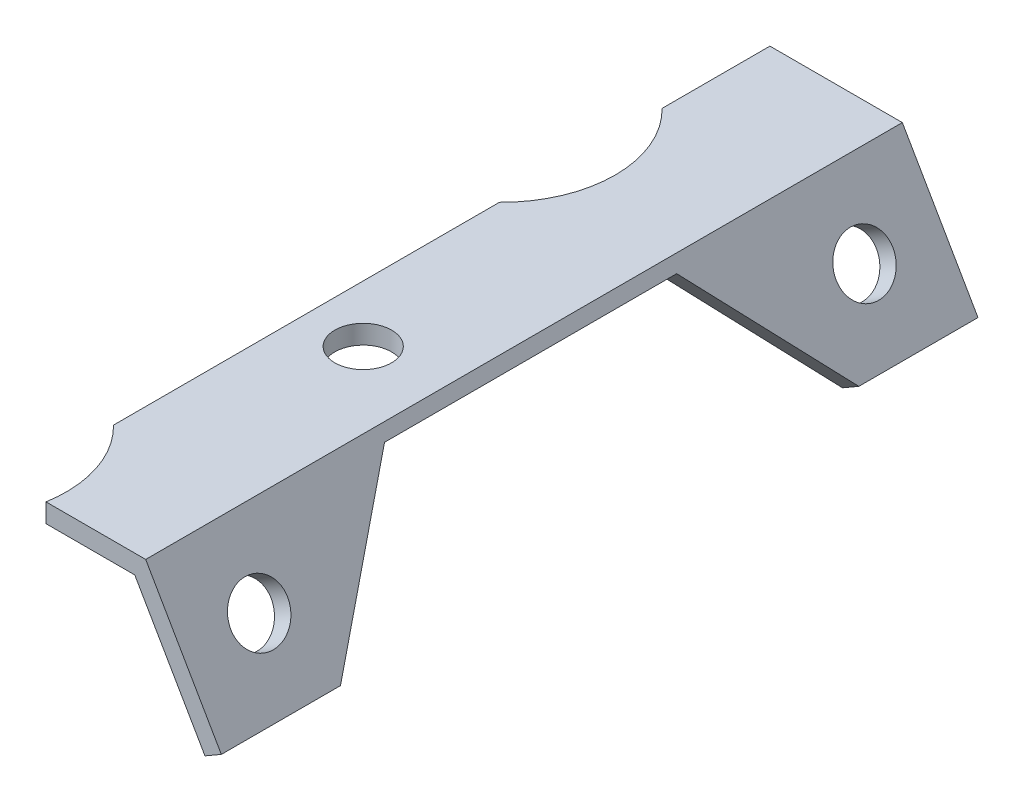
ISO-10303-21;
HEADER;
FILE_DESCRIPTION(('STEP AP214'),'2;1');
FILE_NAME('part.step','',(''),(''),'','','');
FILE_SCHEMA(('AUTOMOTIVE_DESIGN { 1 0 10303 214 1 1 1 1 }'));
ENDSEC;
DATA;
#1=APPLICATION_CONTEXT('core data for automotive mechanical design processes');
#2=APPLICATION_PROTOCOL_DEFINITION('international standard','automotive_design',2000,#1);
#3=PRODUCT_CONTEXT('',#1,'mechanical');
#4=PRODUCT('Part','Part','',(#3));
#5=PRODUCT_RELATED_PRODUCT_CATEGORY('part','',(#4));
#6=PRODUCT_DEFINITION_FORMATION('','',#4);
#7=PRODUCT_DEFINITION_CONTEXT('part definition',#1,'design');
#8=PRODUCT_DEFINITION('design','',#6,#7);
#9=PRODUCT_DEFINITION_SHAPE('','',#8);
#10=(LENGTH_UNIT() NAMED_UNIT(*) SI_UNIT(.MILLI.,.METRE.));
#11=(NAMED_UNIT(*) PLANE_ANGLE_UNIT() SI_UNIT($,.RADIAN.));
#12=(NAMED_UNIT(*) SI_UNIT($,.STERADIAN.) SOLID_ANGLE_UNIT());
#13=UNCERTAINTY_MEASURE_WITH_UNIT(LENGTH_MEASURE(1.E-05),#10,'distance_accuracy_value','');
#14=(GEOMETRIC_REPRESENTATION_CONTEXT(3) GLOBAL_UNCERTAINTY_ASSIGNED_CONTEXT((#13)) GLOBAL_UNIT_ASSIGNED_CONTEXT((#10,
#11,#12)) REPRESENTATION_CONTEXT('',''));
#15=CARTESIAN_POINT('',(0.,0.,0.));
#16=DIRECTION('',(0.,0.,1.));
#17=DIRECTION('',(1.,0.,0.));
#18=AXIS2_PLACEMENT_3D('',#15,#16,#17);
#19=CARTESIAN_POINT('',(0.,13.,40.));
#20=DIRECTION('',(1.,0.,0.));
#21=DIRECTION('',(0.,0.,-1.));
#22=AXIS2_PLACEMENT_3D('',#19,#20,#21);
#23=PLANE('',#22);
#24=DIRECTION('',(0.,0.,-1.));
#25=VECTOR('',#24,1.);
#26=CARTESIAN_POINT('',(0.,13.,40.));
#27=LINE('',#26,#25);
#28=CARTESIAN_POINT('',(0.,13.,5.70112867288058));
#29=VERTEX_POINT('',#28);
#30=CARTESIAN_POINT('',(0.,13.,0.));
#31=VERTEX_POINT('',#30);
#32=EDGE_CURVE('E184',#29,#31,#27,.T.);
#33=ORIENTED_EDGE('',*,*,#32,.F.);
#34=DIRECTION('',(0.,1.,0.));
#35=VECTOR('',#34,1.);
#36=CARTESIAN_POINT('',(0.,4.,5.70112867288058));
#37=LINE('',#36,#35);
#38=CARTESIAN_POINT('',(0.,14.,5.70112867288058));
#39=VERTEX_POINT('',#38);
#40=EDGE_CURVE('E53',#29,#39,#37,.T.);
#41=ORIENTED_EDGE('',*,*,#40,.T.);
#42=DIRECTION('',(0.,0.,-1.));
#43=VECTOR('',#42,1.);
#44=CARTESIAN_POINT('',(0.,14.,40.));
#45=LINE('',#44,#43);
#46=CARTESIAN_POINT('',(0.,14.,0.));
#47=VERTEX_POINT('',#46);
#48=EDGE_CURVE('E187',#39,#47,#45,.T.);
#49=ORIENTED_EDGE('',*,*,#48,.T.);
#50=DIRECTION('',(0.,-1.,0.));
#51=VECTOR('',#50,1.);
#52=CARTESIAN_POINT('',(0.,13.,0.));
#53=LINE('',#52,#51);
#54=EDGE_CURVE('E161',#47,#31,#53,.T.);
#55=ORIENTED_EDGE('',*,*,#54,.T.);
#56=EDGE_LOOP('',(#33,#41,#49,#55));
#57=FACE_BOUND('',#56,.T.);
#58=ADVANCED_FACE('F31',(#57),#23,.F.);
#59=CARTESIAN_POINT('',(10.1339745962156,6.57179676972449,40.));
#60=DIRECTION('',(-0.500000000000002,0.866025403784437,0.));
#61=DIRECTION('',(-0.866025403784437,-0.500000000000002,0.));
#62=AXIS2_PLACEMENT_3D('',#59,#60,#61);
#63=PLANE('',#62);
#64=DIRECTION('',(0.,0.,-1.));
#65=VECTOR('',#64,1.);
#66=CARTESIAN_POINT('',(10.1339745962156,6.57179676972449,40.));
#67=LINE('',#66,#65);
#68=CARTESIAN_POINT('',(10.1339745962156,6.57179676972449,40.));
#69=VERTEX_POINT('',#68);
#70=CARTESIAN_POINT('',(10.1339745962156,6.57179676972449,33.7015307231896));
#71=VERTEX_POINT('',#70);
#72=EDGE_CURVE('E178',#69,#71,#67,.T.);
#73=ORIENTED_EDGE('',*,*,#72,.T.);
#74=DIRECTION('',(0.86602540378444,0.499999999999998,0.));
#75=VECTOR('',#74,1.);
#76=CARTESIAN_POINT('',(10.1339745962156,6.57179676972449,33.7015307231896));
#77=LINE('',#76,#75);
#78=CARTESIAN_POINT('',(11.,7.07179676972449,33.7015307231896));
#79=VERTEX_POINT('',#78);
#80=EDGE_CURVE('E233',#71,#79,#77,.T.);
#81=ORIENTED_EDGE('',*,*,#80,.T.);
#82=DIRECTION('',(0.,0.,-1.));
#83=VECTOR('',#82,1.);
#84=CARTESIAN_POINT('',(11.,7.07179676972449,40.));
#85=LINE('',#84,#83);
#86=CARTESIAN_POINT('',(11.,7.07179676972449,40.));
#87=VERTEX_POINT('',#86);
#88=EDGE_CURVE('E174',#87,#79,#85,.T.);
#89=ORIENTED_EDGE('',*,*,#88,.F.);
#90=DIRECTION('',(0.866025403784437,0.500000000000002,0.));
#91=VECTOR('',#90,1.);
#92=CARTESIAN_POINT('',(10.1339745962156,6.57179676972449,40.));
#93=LINE('',#92,#91);
#94=EDGE_CURVE('E154',#69,#87,#93,.T.);
#95=ORIENTED_EDGE('',*,*,#94,.F.);
#96=EDGE_LOOP('',(#73,#81,#89,#95));
#97=FACE_BOUND('',#96,.T.);
#98=ADVANCED_FACE('F232',(#97),#63,.F.);
#99=CARTESIAN_POINT('',(0.,14.,40.));
#100=DIRECTION('',(0.,-1.,0.));
#101=DIRECTION('',(0.,0.,-1.));
#102=AXIS2_PLACEMENT_3D('',#99,#100,#101);
#103=PLANE('',#102);
#104=CARTESIAN_POINT('',(3.,14.,24.5));
#105=DIRECTION('',(0.,1.,0.));
#106=DIRECTION('',(0.,0.,1.));
#107=AXIS2_PLACEMENT_3D('',#104,#105,#106);
#108=CIRCLE('',#107,1.5);
#109=CARTESIAN_POINT('',(3.,14.,26.));
#110=VERTEX_POINT('',#109);
#111=EDGE_CURVE('E192',#110,#110,#108,.T.);
#112=ORIENTED_EDGE('',*,*,#111,.F.);
#113=EDGE_LOOP('',(#112));
#114=FACE_BOUND('',#113,.T.);
#115=CARTESIAN_POINT('',(0.,14.,34.7011286728806));
#116=VERTEX_POINT('',#115);
#117=CARTESIAN_POINT('',(0.,14.,14.2988713271194));
#118=VERTEX_POINT('',#117);
#119=EDGE_CURVE('E136',#116,#118,#45,.T.);
#120=ORIENTED_EDGE('',*,*,#119,.F.);
#121=CARTESIAN_POINT('',(-4.18565470540398,14.,39.));
#122=DIRECTION('',(0.,1.,0.));
#123=DIRECTION('',(0.,0.,1.));
#124=AXIS2_PLACEMENT_3D('',#121,#122,#123);
#125=CIRCLE('',#124,6.);
#126=CARTESIAN_POINT('',(1.73042507769564,14.,40.));
#127=VERTEX_POINT('',#126);
#128=EDGE_CURVE('E125',#127,#116,#125,.T.);
#129=ORIENTED_EDGE('',*,*,#128,.F.);
#130=DIRECTION('',(-1.,0.,0.));
#131=VECTOR('',#130,1.);
#132=CARTESIAN_POINT('',(0.,14.,40.));
#133=LINE('',#132,#131);
#134=CARTESIAN_POINT('',(7.,14.,40.));
#135=VERTEX_POINT('',#134);
#136=EDGE_CURVE('E134',#135,#127,#133,.T.);
#137=ORIENTED_EDGE('',*,*,#136,.F.);
#138=DIRECTION('',(0.,0.,-1.));
#139=VECTOR('',#138,1.);
#140=CARTESIAN_POINT('',(7.,14.,40.));
#141=LINE('',#140,#139);
#142=CARTESIAN_POINT('',(7.,14.,0.));
#143=VERTEX_POINT('',#142);
#144=EDGE_CURVE('E157',#135,#143,#141,.T.);
#145=ORIENTED_EDGE('',*,*,#144,.T.);
#146=DIRECTION('',(-1.,0.,0.));
#147=VECTOR('',#146,1.);
#148=CARTESIAN_POINT('',(0.,14.,0.));
#149=LINE('',#148,#147);
#150=EDGE_CURVE('E158',#143,#47,#149,.T.);
#151=ORIENTED_EDGE('',*,*,#150,.T.);
#152=ORIENTED_EDGE('',*,*,#48,.F.);
#153=CARTESIAN_POINT('',(-4.18565470540398,14.,10.));
#154=DIRECTION('',(0.,1.,0.));
#155=DIRECTION('',(0.,0.,1.));
#156=AXIS2_PLACEMENT_3D('',#153,#154,#155);
#157=CIRCLE('',#156,6.);
#158=EDGE_CURVE('E295',#118,#39,#157,.T.);
#159=ORIENTED_EDGE('',*,*,#158,.F.);
#160=EDGE_LOOP('',(#120,#129,#137,#145,#151,#152,#159));
#161=FACE_BOUND('',#160,.T.);
#162=ADVANCED_FACE('F33',(#114,#161),#103,.F.);
#163=CARTESIAN_POINT('',(0.,13.,34.7011286728806));
#164=VERTEX_POINT('',#163);
#165=CARTESIAN_POINT('',(0.,13.,14.2988713271194));
#166=VERTEX_POINT('',#165);
#167=EDGE_CURVE('E185',#164,#166,#27,.T.);
#168=ORIENTED_EDGE('',*,*,#167,.F.);
#169=DIRECTION('',(0.,1.,0.));
#170=VECTOR('',#169,1.);
#171=CARTESIAN_POINT('',(0.,4.,34.7011286728806));
#172=LINE('',#171,#170);
#173=EDGE_CURVE('E293',#164,#116,#172,.T.);
#174=ORIENTED_EDGE('',*,*,#173,.T.);
#175=ORIENTED_EDGE('',*,*,#119,.T.);
#176=DIRECTION('',(0.,1.,0.));
#177=VECTOR('',#176,1.);
#178=CARTESIAN_POINT('',(0.,4.,14.2988713271194));
#179=LINE('',#178,#177);
#180=EDGE_CURVE('E294',#118,#166,#179,.F.);
#181=ORIENTED_EDGE('',*,*,#180,.T.);
#182=EDGE_LOOP('',(#168,#174,#175,#181));
#183=FACE_BOUND('',#182,.T.);
#184=ADVANCED_FACE('F279',(#183),#23,.F.);
#185=CARTESIAN_POINT('',(1.,13.,40.));
#186=DIRECTION('',(0.,1.,0.));
#187=DIRECTION('',(0.,0.,1.));
#188=AXIS2_PLACEMENT_3D('',#185,#186,#187);
#189=PLANE('',#188);
#190=CARTESIAN_POINT('',(3.,13.,24.5));
#191=DIRECTION('',(0.,1.,0.));
#192=DIRECTION('',(0.,0.,1.));
#193=AXIS2_PLACEMENT_3D('',#190,#191,#192);
#194=CIRCLE('',#193,1.5);
#195=CARTESIAN_POINT('',(3.,13.,26.));
#196=VERTEX_POINT('',#195);
#197=EDGE_CURVE('E189',#196,#196,#194,.T.);
#198=ORIENTED_EDGE('',*,*,#197,.T.);
#199=EDGE_LOOP('',(#198));
#200=FACE_BOUND('',#199,.T.);
#201=DIRECTION('',(1.,0.,0.));
#202=VECTOR('',#201,1.);
#203=CARTESIAN_POINT('',(1.,13.,40.));
#204=LINE('',#203,#202);
#205=CARTESIAN_POINT('',(1.73042507769564,13.,40.));
#206=VERTEX_POINT('',#205);
#207=CARTESIAN_POINT('',(6.42264973081037,13.,40.));
#208=VERTEX_POINT('',#207);
#209=EDGE_CURVE('E142',#206,#208,#204,.T.);
#210=ORIENTED_EDGE('',*,*,#209,.F.);
#211=CARTESIAN_POINT('',(-4.18565470540398,13.,39.));
#212=DIRECTION('',(0.,1.,0.));
#213=DIRECTION('',(0.,0.,1.));
#214=AXIS2_PLACEMENT_3D('',#211,#212,#213);
#215=CIRCLE('',#214,6.);
#216=EDGE_CURVE('E45',#206,#164,#215,.T.);
#217=ORIENTED_EDGE('',*,*,#216,.T.);
#218=ORIENTED_EDGE('',*,*,#167,.T.);
#219=CARTESIAN_POINT('',(-4.18565470540398,13.,10.));
#220=DIRECTION('',(0.,1.,0.));
#221=DIRECTION('',(0.,0.,1.));
#222=AXIS2_PLACEMENT_3D('',#219,#220,#221);
#223=CIRCLE('',#222,6.);
#224=EDGE_CURVE('E39',#166,#29,#223,.T.);
#225=ORIENTED_EDGE('',*,*,#224,.T.);
#226=ORIENTED_EDGE('',*,*,#32,.T.);
#227=DIRECTION('',(1.,0.,0.));
#228=VECTOR('',#227,1.);
#229=CARTESIAN_POINT('',(1.,13.,0.));
#230=LINE('',#229,#228);
#231=CARTESIAN_POINT('',(6.42264973081037,13.,0.));
#232=VERTEX_POINT('',#231);
#233=EDGE_CURVE('E165',#31,#232,#230,.T.);
#234=ORIENTED_EDGE('',*,*,#233,.T.);
#235=DIRECTION('',(0.,0.,-1.));
#236=VECTOR('',#235,1.);
#237=CARTESIAN_POINT('',(6.42264973081037,13.,40.));
#238=LINE('',#237,#236);
#239=EDGE_CURVE('E181',#208,#232,#238,.T.);
#240=ORIENTED_EDGE('',*,*,#239,.F.);
#241=EDGE_LOOP('',(#210,#217,#218,#225,#226,#234,#240));
#242=FACE_BOUND('',#241,.T.);
#243=ADVANCED_FACE('F195',(#200,#242),#189,.F.);
#244=CARTESIAN_POINT('',(6.42264973081037,13.,40.));
#245=DIRECTION('',(0.866025403784439,0.5,0.));
#246=DIRECTION('',(-0.5,0.866025403784439,0.));
#247=AXIS2_PLACEMENT_3D('',#244,#245,#246);
#248=PLANE('',#247);
#249=CARTESIAN_POINT('',(8.13397459621557,10.0358983848623,4.));
#250=DIRECTION('',(0.86602540378444,0.499999999999998,0.));
#251=DIRECTION('',(-0.499999999999998,0.86602540378444,0.));
#252=AXIS2_PLACEMENT_3D('',#249,#250,#251);
#253=CIRCLE('',#252,1.5);
#254=CARTESIAN_POINT('',(7.38397459621558,11.3349364905389,4.));
#255=VERTEX_POINT('',#254);
#256=EDGE_CURVE('E254',#255,#255,#253,.T.);
#257=ORIENTED_EDGE('',*,*,#256,.T.);
#258=EDGE_LOOP('',(#257));
#259=FACE_BOUND('',#258,.T.);
#260=CARTESIAN_POINT('',(8.13397459621557,10.0358983848623,36.));
#261=DIRECTION('',(0.86602540378444,0.499999999999998,0.));
#262=DIRECTION('',(-0.499999999999998,0.86602540378444,0.));
#263=AXIS2_PLACEMENT_3D('',#260,#261,#262);
#264=CIRCLE('',#263,1.5);
#265=CARTESIAN_POINT('',(7.38397459621557,11.3349364905389,36.));
#266=VERTEX_POINT('',#265);
#267=EDGE_CURVE('E162',#266,#266,#264,.T.);
#268=ORIENTED_EDGE('',*,*,#267,.T.);
#269=EDGE_LOOP('',(#268));
#270=FACE_BOUND('',#269,.T.);
#271=DIRECTION('',(0.,0.,1.));
#272=VECTOR('',#271,1.);
#273=CARTESIAN_POINT('',(6.48247202523645,12.8963847466287,27.7217103108883));
#274=LINE('',#273,#272);
#275=CARTESIAN_POINT('',(6.48247202523645,12.8963847466287,12.2782896891117));
#276=VERTEX_POINT('',#275);
#277=CARTESIAN_POINT('',(6.48247202523645,12.8963847466287,27.7217103108883));
#278=VERTEX_POINT('',#277);
#279=EDGE_CURVE('E242',#276,#278,#274,.T.);
#280=ORIENTED_EDGE('',*,*,#279,.T.);
#281=DIRECTION('',(0.386858304812937,-0.670058239265979,0.633531852387106));
#282=VECTOR('',#281,1.);
#283=CARTESIAN_POINT('',(10.1339745962156,6.57179676972449,33.7015307231896));
#284=LINE('',#283,#282);
#285=EDGE_CURVE('E229',#278,#71,#284,.T.);
#286=ORIENTED_EDGE('',*,*,#285,.T.);
#287=ORIENTED_EDGE('',*,*,#72,.F.);
#288=DIRECTION('',(0.5,-0.866025403784439,0.));
#289=VECTOR('',#288,1.);
#290=CARTESIAN_POINT('',(6.42264973081037,13.,40.));
#291=LINE('',#290,#289);
#292=EDGE_CURVE('E145',#208,#69,#291,.T.);
#293=ORIENTED_EDGE('',*,*,#292,.F.);
#294=ORIENTED_EDGE('',*,*,#239,.T.);
#295=DIRECTION('',(0.5,-0.866025403784439,0.));
#296=VECTOR('',#295,1.);
#297=CARTESIAN_POINT('',(6.42264973081037,13.,0.));
#298=LINE('',#297,#296);
#299=CARTESIAN_POINT('',(10.1339745962156,6.57179676972449,0.));
#300=VERTEX_POINT('',#299);
#301=EDGE_CURVE('E167',#232,#300,#298,.T.);
#302=ORIENTED_EDGE('',*,*,#301,.T.);
#303=CARTESIAN_POINT('',(10.1339745962156,6.57179676972449,6.29846927681038));
#304=VERTEX_POINT('',#303);
#305=EDGE_CURVE('E177',#304,#300,#67,.T.);
#306=ORIENTED_EDGE('',*,*,#305,.F.);
#307=DIRECTION('',(-0.386858304812937,0.670058239265979,0.633531852387106));
#308=VECTOR('',#307,1.);
#309=CARTESIAN_POINT('',(10.1339745962156,6.57179676972449,6.29846927681038));
#310=LINE('',#309,#308);
#311=EDGE_CURVE('E240',#304,#276,#310,.T.);
#312=ORIENTED_EDGE('',*,*,#311,.T.);
#313=EDGE_LOOP('',(#280,#286,#287,#293,#294,#302,#306,#312));
#314=FACE_BOUND('',#313,.T.);
#315=ADVANCED_FACE('F221',(#259,#270,#314),#248,.F.);
#316=CARTESIAN_POINT('',(11.,7.07179676972449,6.29846927681038));
#317=VERTEX_POINT('',#316);
#318=CARTESIAN_POINT('',(11.,7.07179676972449,0.));
#319=VERTEX_POINT('',#318);
#320=EDGE_CURVE('E173',#317,#319,#85,.T.);
#321=ORIENTED_EDGE('',*,*,#320,.F.);
#322=DIRECTION('',(0.86602540378444,0.499999999999998,0.));
#323=VECTOR('',#322,1.);
#324=CARTESIAN_POINT('',(10.1339745962156,6.57179676972449,6.29846927681038));
#325=LINE('',#324,#323);
#326=EDGE_CURVE('E217',#304,#317,#325,.T.);
#327=ORIENTED_EDGE('',*,*,#326,.F.);
#328=ORIENTED_EDGE('',*,*,#305,.T.);
#329=DIRECTION('',(0.866025403784437,0.500000000000002,0.));
#330=VECTOR('',#329,1.);
#331=CARTESIAN_POINT('',(10.1339745962156,6.57179676972449,0.));
#332=LINE('',#331,#330);
#333=EDGE_CURVE('E147',#300,#319,#332,.T.);
#334=ORIENTED_EDGE('',*,*,#333,.T.);
#335=EDGE_LOOP('',(#321,#327,#328,#334));
#336=FACE_BOUND('',#335,.T.);
#337=ADVANCED_FACE('F214',(#336),#63,.F.);
#338=CARTESIAN_POINT('',(7.,14.,40.));
#339=DIRECTION('',(-0.866025403784439,-0.5,0.));
#340=DIRECTION('',(0.5,-0.866025403784439,0.));
#341=AXIS2_PLACEMENT_3D('',#338,#339,#340);
#342=PLANE('',#341);
#343=CARTESIAN_POINT('',(9.00000000000001,10.5358983848623,4.));
#344=DIRECTION('',(0.86602540378444,0.499999999999998,0.));
#345=DIRECTION('',(-0.499999999999998,0.86602540378444,0.));
#346=AXIS2_PLACEMENT_3D('',#343,#344,#345);
#347=CIRCLE('',#346,1.5);
#348=CARTESIAN_POINT('',(8.25000000000002,11.8349364905389,4.));
#349=VERTEX_POINT('',#348);
#350=EDGE_CURVE('E248',#349,#349,#347,.T.);
#351=ORIENTED_EDGE('',*,*,#350,.F.);
#352=EDGE_LOOP('',(#351));
#353=FACE_BOUND('',#352,.T.);
#354=CARTESIAN_POINT('',(9.00000000000001,10.5358983848623,36.));
#355=DIRECTION('',(0.86602540378444,0.499999999999998,0.));
#356=DIRECTION('',(-0.499999999999998,0.86602540378444,0.));
#357=AXIS2_PLACEMENT_3D('',#354,#355,#356);
#358=CIRCLE('',#357,1.5);
#359=CARTESIAN_POINT('',(8.25000000000001,11.8349364905389,36.));
#360=VERTEX_POINT('',#359);
#361=EDGE_CURVE('E150',#360,#360,#358,.T.);
#362=ORIENTED_EDGE('',*,*,#361,.F.);
#363=EDGE_LOOP('',(#362));
#364=FACE_BOUND('',#363,.T.);
#365=ORIENTED_EDGE('',*,*,#88,.T.);
#366=DIRECTION('',(0.386858304812937,-0.670058239265979,0.633531852387106));
#367=VECTOR('',#366,1.);
#368=CARTESIAN_POINT('',(11.,7.07179676972449,33.7015307231896));
#369=LINE('',#368,#367);
#370=CARTESIAN_POINT('',(7.34849742902089,13.3963847466287,27.7217103108883));
#371=VERTEX_POINT('',#370);
#372=EDGE_CURVE('E236',#371,#79,#369,.T.);
#373=ORIENTED_EDGE('',*,*,#372,.F.);
#374=DIRECTION('',(0.,0.,1.));
#375=VECTOR('',#374,1.);
#376=CARTESIAN_POINT('',(7.34849742902089,13.3963847466287,27.7217103108883));
#377=LINE('',#376,#375);
#378=CARTESIAN_POINT('',(7.34849742902089,13.3963847466287,12.2782896891117));
#379=VERTEX_POINT('',#378);
#380=EDGE_CURVE('E238',#379,#371,#377,.T.);
#381=ORIENTED_EDGE('',*,*,#380,.F.);
#382=DIRECTION('',(-0.386858304812937,0.670058239265979,0.633531852387106));
#383=VECTOR('',#382,1.);
#384=CARTESIAN_POINT('',(11.,7.07179676972449,6.29846927681038));
#385=LINE('',#384,#383);
#386=EDGE_CURVE('E191',#317,#379,#385,.T.);
#387=ORIENTED_EDGE('',*,*,#386,.F.);
#388=ORIENTED_EDGE('',*,*,#320,.T.);
#389=DIRECTION('',(-0.5,0.866025403784439,0.));
#390=VECTOR('',#389,1.);
#391=CARTESIAN_POINT('',(7.,14.,0.));
#392=LINE('',#391,#390);
#393=EDGE_CURVE('E143',#319,#143,#392,.T.);
#394=ORIENTED_EDGE('',*,*,#393,.T.);
#395=ORIENTED_EDGE('',*,*,#144,.F.);
#396=DIRECTION('',(-0.5,0.866025403784439,0.));
#397=VECTOR('',#396,1.);
#398=CARTESIAN_POINT('',(7.,14.,40.));
#399=LINE('',#398,#397);
#400=EDGE_CURVE('E140',#87,#135,#399,.T.);
#401=ORIENTED_EDGE('',*,*,#400,.F.);
#402=EDGE_LOOP('',(#365,#373,#381,#387,#388,#394,#395,#401));
#403=FACE_BOUND('',#402,.T.);
#404=ADVANCED_FACE('F209',(#353,#364,#403),#342,.F.);
#405=CARTESIAN_POINT('',(0.,14.,40.));
#406=DIRECTION('',(0.,0.,1.));
#407=DIRECTION('',(1.,0.,0.));
#408=AXIS2_PLACEMENT_3D('',#405,#406,#407);
#409=PLANE('',#408);
#410=DIRECTION('',(0.,1.,0.));
#411=VECTOR('',#410,1.);
#412=CARTESIAN_POINT('',(1.73042507769564,4.,40.));
#413=LINE('',#412,#411);
#414=EDGE_CURVE('E11',#206,#127,#413,.T.);
#415=ORIENTED_EDGE('',*,*,#414,.F.);
#416=ORIENTED_EDGE('',*,*,#209,.T.);
#417=ORIENTED_EDGE('',*,*,#292,.T.);
#418=ORIENTED_EDGE('',*,*,#94,.T.);
#419=ORIENTED_EDGE('',*,*,#400,.T.);
#420=ORIENTED_EDGE('',*,*,#136,.T.);
#421=EDGE_LOOP('',(#415,#416,#417,#418,#419,#420));
#422=FACE_BOUND('',#421,.T.);
#423=ADVANCED_FACE('F138',(#422),#409,.T.);
#424=CARTESIAN_POINT('',(0.,14.,0.));
#425=DIRECTION('',(0.,0.,1.));
#426=DIRECTION('',(1.,0.,0.));
#427=AXIS2_PLACEMENT_3D('',#424,#425,#426);
#428=PLANE('',#427);
#429=ORIENTED_EDGE('',*,*,#150,.F.);
#430=ORIENTED_EDGE('',*,*,#393,.F.);
#431=ORIENTED_EDGE('',*,*,#333,.F.);
#432=ORIENTED_EDGE('',*,*,#301,.F.);
#433=ORIENTED_EDGE('',*,*,#233,.F.);
#434=ORIENTED_EDGE('',*,*,#54,.F.);
#435=EDGE_LOOP('',(#429,#430,#431,#432,#433,#434));
#436=FACE_BOUND('',#435,.T.);
#437=ADVANCED_FACE('F205',(#436),#428,.F.);
#438=CARTESIAN_POINT('',(8.13397459621557,10.0358983848623,36.));
#439=DIRECTION('',(0.86602540378444,0.499999999999998,0.));
#440=DIRECTION('',(-0.499999999999998,0.86602540378444,0.));
#441=AXIS2_PLACEMENT_3D('',#438,#439,#440);
#442=CYLINDRICAL_SURFACE('',#441,1.5);
#443=ORIENTED_EDGE('',*,*,#267,.F.);
#444=EDGE_LOOP('',(#443));
#445=FACE_BOUND('',#444,.T.);
#446=ORIENTED_EDGE('',*,*,#361,.T.);
#447=EDGE_LOOP('',(#446));
#448=FACE_BOUND('',#447,.T.);
#449=ADVANCED_FACE('F264',(#445,#448),#442,.F.);
#450=CARTESIAN_POINT('',(8.13397459621557,10.0358983848623,4.));
#451=DIRECTION('',(0.86602540378444,0.499999999999998,0.));
#452=DIRECTION('',(-0.499999999999998,0.86602540378444,0.));
#453=AXIS2_PLACEMENT_3D('',#450,#451,#452);
#454=CYLINDRICAL_SURFACE('',#453,1.5);
#455=ORIENTED_EDGE('',*,*,#256,.F.);
#456=EDGE_LOOP('',(#455));
#457=FACE_BOUND('',#456,.T.);
#458=ORIENTED_EDGE('',*,*,#350,.T.);
#459=EDGE_LOOP('',(#458));
#460=FACE_BOUND('',#459,.T.);
#461=ADVANCED_FACE('F312',(#457,#460),#454,.F.);
#462=CARTESIAN_POINT('',(10.1339745962156,6.57179676972449,33.7015307231896));
#463=DIRECTION('',(-0.316765926193551,0.548654678273848,0.773716609625878));
#464=DIRECTION('',(0.,-0.815723307792225,0.578442291957038));
#465=AXIS2_PLACEMENT_3D('',#462,#463,#464);
#466=PLANE('',#465);
#467=ORIENTED_EDGE('',*,*,#372,.T.);
#468=ORIENTED_EDGE('',*,*,#80,.F.);
#469=ORIENTED_EDGE('',*,*,#285,.F.);
#470=DIRECTION('',(0.86602540378444,0.499999999999998,0.));
#471=VECTOR('',#470,1.);
#472=CARTESIAN_POINT('',(6.48247202523645,12.8963847466287,27.7217103108883));
#473=LINE('',#472,#471);
#474=EDGE_CURVE('E249',#278,#371,#473,.T.);
#475=ORIENTED_EDGE('',*,*,#474,.T.);
#476=EDGE_LOOP('',(#467,#468,#469,#475));
#477=FACE_BOUND('',#476,.T.);
#478=ADVANCED_FACE('F310',(#477),#466,.F.);
#479=CARTESIAN_POINT('',(6.48247202523645,12.8963847466287,27.7217103108883));
#480=DIRECTION('',(-0.499999999999998,0.86602540378444,0.));
#481=DIRECTION('',(-0.86602540378444,-0.499999999999998,0.));
#482=AXIS2_PLACEMENT_3D('',#479,#480,#481);
#483=PLANE('',#482);
#484=ORIENTED_EDGE('',*,*,#380,.T.);
#485=ORIENTED_EDGE('',*,*,#474,.F.);
#486=ORIENTED_EDGE('',*,*,#279,.F.);
#487=DIRECTION('',(0.86602540378444,0.499999999999998,0.));
#488=VECTOR('',#487,1.);
#489=CARTESIAN_POINT('',(6.48247202523645,12.8963847466287,12.2782896891117));
#490=LINE('',#489,#488);
#491=EDGE_CURVE('E251',#276,#379,#490,.T.);
#492=ORIENTED_EDGE('',*,*,#491,.T.);
#493=EDGE_LOOP('',(#484,#485,#486,#492));
#494=FACE_BOUND('',#493,.T.);
#495=ADVANCED_FACE('F309',(#494),#483,.F.);
#496=CARTESIAN_POINT('',(10.1339745962156,6.57179676972449,6.29846927681038));
#497=DIRECTION('',(-0.316765926193551,0.548654678273848,-0.773716609625878));
#498=DIRECTION('',(0.,0.815723307792225,0.578442291957038));
#499=AXIS2_PLACEMENT_3D('',#496,#497,#498);
#500=PLANE('',#499);
#501=ORIENTED_EDGE('',*,*,#386,.T.);
#502=ORIENTED_EDGE('',*,*,#491,.F.);
#503=ORIENTED_EDGE('',*,*,#311,.F.);
#504=ORIENTED_EDGE('',*,*,#326,.T.);
#505=EDGE_LOOP('',(#501,#502,#503,#504));
#506=FACE_BOUND('',#505,.T.);
#507=ADVANCED_FACE('F306',(#506),#500,.F.);
#508=CARTESIAN_POINT('',(3.,4.,24.5));
#509=DIRECTION('',(0.,1.,0.));
#510=DIRECTION('',(0.,0.,1.));
#511=AXIS2_PLACEMENT_3D('',#508,#509,#510);
#512=CYLINDRICAL_SURFACE('',#511,1.5);
#513=ORIENTED_EDGE('',*,*,#111,.T.);
#514=EDGE_LOOP('',(#513));
#515=FACE_BOUND('',#514,.T.);
#516=ORIENTED_EDGE('',*,*,#197,.F.);
#517=EDGE_LOOP('',(#516));
#518=FACE_BOUND('',#517,.T.);
#519=ADVANCED_FACE('F322',(#515,#518),#512,.F.);
#520=CARTESIAN_POINT('',(-4.18565470540398,4.,10.));
#521=DIRECTION('',(0.,1.,0.));
#522=DIRECTION('',(0.,0.,1.));
#523=AXIS2_PLACEMENT_3D('',#520,#521,#522);
#524=CYLINDRICAL_SURFACE('',#523,6.);
#525=ORIENTED_EDGE('',*,*,#224,.F.);
#526=ORIENTED_EDGE('',*,*,#180,.F.);
#527=ORIENTED_EDGE('',*,*,#158,.T.);
#528=ORIENTED_EDGE('',*,*,#40,.F.);
#529=EDGE_LOOP('',(#525,#526,#527,#528));
#530=FACE_BOUND('',#529,.T.);
#531=ADVANCED_FACE('F371',(#530),#524,.F.);
#532=CARTESIAN_POINT('',(-4.18565470540398,4.,39.));
#533=DIRECTION('',(0.,1.,0.));
#534=DIRECTION('',(0.,0.,1.));
#535=AXIS2_PLACEMENT_3D('',#532,#533,#534);
#536=CYLINDRICAL_SURFACE('',#535,6.);
#537=ORIENTED_EDGE('',*,*,#216,.F.);
#538=ORIENTED_EDGE('',*,*,#414,.T.);
#539=ORIENTED_EDGE('',*,*,#128,.T.);
#540=ORIENTED_EDGE('',*,*,#173,.F.);
#541=EDGE_LOOP('',(#537,#538,#539,#540));
#542=FACE_BOUND('',#541,.T.);
#543=ADVANCED_FACE('F124',(#542),#536,.F.);
#544=CLOSED_SHELL('',(#58,#98,#162,#184,#243,#315,#337,#404,#423,#437,#449,#461,#478,#495,#507,
#519,#531,#543));
#545=MANIFOLD_SOLID_BREP('B2',#544);
#546=ADVANCED_BREP_SHAPE_REPRESENTATION('',(#18,#545),#14);
#547=SHAPE_DEFINITION_REPRESENTATION(#9,#546);
ENDSEC;
END-ISO-10303-21;
